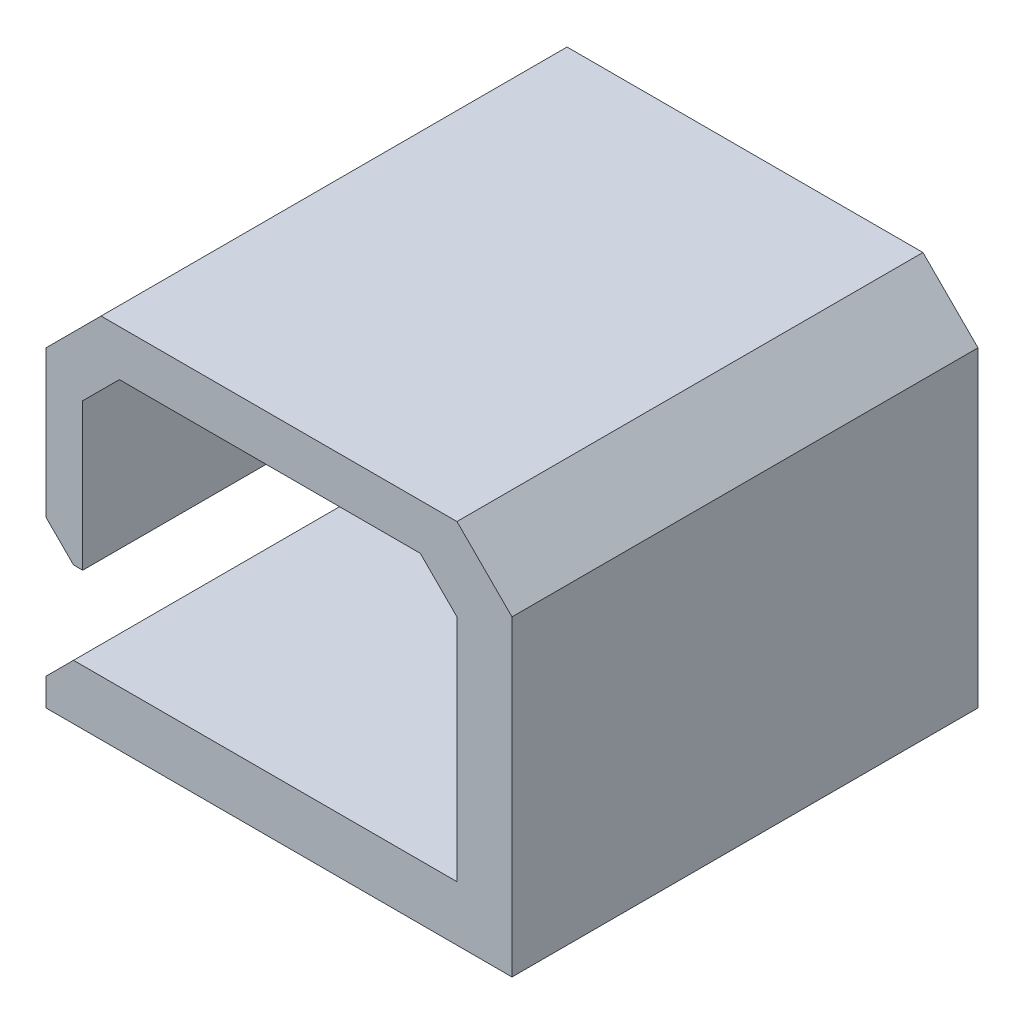
ISO-10303-21;
HEADER;
FILE_DESCRIPTION(('STEP AP214'),'2;1');
FILE_NAME('part.step','',(''),(''),'','','');
FILE_SCHEMA(('AUTOMOTIVE_DESIGN { 1 0 10303 214 1 1 1 1 }'));
ENDSEC;
DATA;
#1=APPLICATION_CONTEXT('core data for automotive mechanical design processes');
#2=APPLICATION_PROTOCOL_DEFINITION('international standard','automotive_design',2000,#1);
#3=PRODUCT_CONTEXT('',#1,'mechanical');
#4=PRODUCT('Part','Part','',(#3));
#5=PRODUCT_RELATED_PRODUCT_CATEGORY('part','',(#4));
#6=PRODUCT_DEFINITION_FORMATION('','',#4);
#7=PRODUCT_DEFINITION_CONTEXT('part definition',#1,'design');
#8=PRODUCT_DEFINITION('design','',#6,#7);
#9=PRODUCT_DEFINITION_SHAPE('','',#8);
#10=(LENGTH_UNIT() NAMED_UNIT(*) SI_UNIT(.MILLI.,.METRE.));
#11=(NAMED_UNIT(*) PLANE_ANGLE_UNIT() SI_UNIT($,.RADIAN.));
#12=(NAMED_UNIT(*) SI_UNIT($,.STERADIAN.) SOLID_ANGLE_UNIT());
#13=UNCERTAINTY_MEASURE_WITH_UNIT(LENGTH_MEASURE(1.E-05),#10,'distance_accuracy_value','');
#14=(GEOMETRIC_REPRESENTATION_CONTEXT(3) GLOBAL_UNCERTAINTY_ASSIGNED_CONTEXT((#13)) GLOBAL_UNIT_ASSIGNED_CONTEXT((#10,
#11,#12)) REPRESENTATION_CONTEXT('',''));
#15=CARTESIAN_POINT('',(0.,0.,0.));
#16=DIRECTION('',(0.,0.,1.));
#17=DIRECTION('',(1.,0.,0.));
#18=AXIS2_PLACEMENT_3D('',#15,#16,#17);
#19=CARTESIAN_POINT('',(-12.7,17.5,12.7));
#20=DIRECTION('',(0.,1.,0.));
#21=DIRECTION('',(0.,0.,1.));
#22=AXIS2_PLACEMENT_3D('',#19,#20,#21);
#23=PLANE('',#22);
#24=DIRECTION('',(1.,0.,0.));
#25=VECTOR('',#24,1.);
#26=CARTESIAN_POINT('',(-12.7,17.5,-12.7));
#27=LINE('',#26,#25);
#28=CARTESIAN_POINT('',(-8.7,17.5,-12.7));
#29=VERTEX_POINT('',#28);
#30=CARTESIAN_POINT('',(7.69999999999999,17.5,-12.7));
#31=VERTEX_POINT('',#30);
#32=EDGE_CURVE('E183',#29,#31,#27,.T.);
#33=ORIENTED_EDGE('',*,*,#32,.T.);
#34=DIRECTION('',(0.,0.,1.));
#35=VECTOR('',#34,1.);
#36=CARTESIAN_POINT('',(7.69999999999999,17.5,12.7));
#37=LINE('',#36,#35);
#38=CARTESIAN_POINT('',(7.69999999999999,17.5,12.7));
#39=VERTEX_POINT('',#38);
#40=EDGE_CURVE('E252',#31,#39,#37,.T.);
#41=ORIENTED_EDGE('',*,*,#40,.T.);
#42=DIRECTION('',(1.,0.,0.));
#43=VECTOR('',#42,1.);
#44=CARTESIAN_POINT('',(-12.7,17.5,12.7));
#45=LINE('',#44,#43);
#46=CARTESIAN_POINT('',(-8.7,17.5,12.7));
#47=VERTEX_POINT('',#46);
#48=EDGE_CURVE('E180',#47,#39,#45,.T.);
#49=ORIENTED_EDGE('',*,*,#48,.F.);
#50=DIRECTION('',(0.,0.,-1.));
#51=VECTOR('',#50,1.);
#52=CARTESIAN_POINT('',(-8.7,17.5,-12.7));
#53=LINE('',#52,#51);
#54=EDGE_CURVE('E250',#47,#29,#53,.T.);
#55=ORIENTED_EDGE('',*,*,#54,.T.);
#56=EDGE_LOOP('',(#33,#41,#49,#55));
#57=FACE_BOUND('',#56,.T.);
#58=ADVANCED_FACE('F33',(#57),#23,.F.);
#59=CARTESIAN_POINT('',(9.7,20.,-12.7));
#60=DIRECTION('',(1.,0.,0.));
#61=DIRECTION('',(0.,0.,-1.));
#62=AXIS2_PLACEMENT_3D('',#59,#60,#61);
#63=PLANE('',#62);
#64=DIRECTION('',(0.,-1.,0.));
#65=VECTOR('',#64,1.);
#66=CARTESIAN_POINT('',(9.70000000000001,20.,12.7));
#67=LINE('',#66,#65);
#68=CARTESIAN_POINT('',(9.70000000000001,15.5,12.7));
#69=VERTEX_POINT('',#68);
#70=CARTESIAN_POINT('',(9.70000000000001,3.,12.7));
#71=VERTEX_POINT('',#70);
#72=EDGE_CURVE('E193',#69,#71,#67,.T.);
#73=ORIENTED_EDGE('',*,*,#72,.F.);
#74=DIRECTION('',(0.,0.,-1.));
#75=VECTOR('',#74,1.);
#76=CARTESIAN_POINT('',(9.7,15.5,-12.7));
#77=LINE('',#76,#75);
#78=CARTESIAN_POINT('',(9.7,15.5,-12.7));
#79=VERTEX_POINT('',#78);
#80=EDGE_CURVE('E255',#69,#79,#77,.T.);
#81=ORIENTED_EDGE('',*,*,#80,.T.);
#82=DIRECTION('',(0.,-1.,0.));
#83=VECTOR('',#82,1.);
#84=CARTESIAN_POINT('',(9.7,20.,-12.7));
#85=LINE('',#84,#83);
#86=CARTESIAN_POINT('',(9.70000000000001,3.,-12.7));
#87=VERTEX_POINT('',#86);
#88=EDGE_CURVE('E198',#79,#87,#85,.T.);
#89=ORIENTED_EDGE('',*,*,#88,.T.);
#90=DIRECTION('',(0.,0.,1.));
#91=VECTOR('',#90,1.);
#92=CARTESIAN_POINT('',(9.7,3.,-12.7));
#93=LINE('',#92,#91);
#94=EDGE_CURVE('E186',#87,#71,#93,.T.);
#95=ORIENTED_EDGE('',*,*,#94,.T.);
#96=EDGE_LOOP('',(#73,#81,#89,#95));
#97=FACE_BOUND('',#96,.T.);
#98=ADVANCED_FACE('F280',(#97),#63,.F.);
#99=CARTESIAN_POINT('',(0.,3.,0.));
#100=DIRECTION('',(0.,-1.,0.));
#101=DIRECTION('',(0.,0.,-1.));
#102=AXIS2_PLACEMENT_3D('',#99,#100,#101);
#103=PLANE('',#102);
#104=DIRECTION('',(-1.,0.,0.));
#105=VECTOR('',#104,1.);
#106=CARTESIAN_POINT('',(-12.7,3.,-12.7));
#107=LINE('',#106,#105);
#108=CARTESIAN_POINT('',(-11.2,3.,-12.7));
#109=VERTEX_POINT('',#108);
#110=EDGE_CURVE('E201',#87,#109,#107,.T.);
#111=ORIENTED_EDGE('',*,*,#110,.T.);
#112=DIRECTION('',(0.,0.,1.));
#113=VECTOR('',#112,1.);
#114=CARTESIAN_POINT('',(-11.2,3.,0.));
#115=LINE('',#114,#113);
#116=CARTESIAN_POINT('',(-11.2,3.,12.7));
#117=VERTEX_POINT('',#116);
#118=EDGE_CURVE('E266',#109,#117,#115,.T.);
#119=ORIENTED_EDGE('',*,*,#118,.T.);
#120=DIRECTION('',(1.,0.,0.));
#121=VECTOR('',#120,1.);
#122=CARTESIAN_POINT('',(-12.7,3.,12.7));
#123=LINE('',#122,#121);
#124=EDGE_CURVE('E204',#117,#71,#123,.T.);
#125=ORIENTED_EDGE('',*,*,#124,.T.);
#126=ORIENTED_EDGE('',*,*,#94,.F.);
#127=EDGE_LOOP('',(#111,#119,#125,#126));
#128=FACE_BOUND('',#127,.T.);
#129=ADVANCED_FACE('F271',(#128),#103,.F.);
#130=CARTESIAN_POINT('',(12.7,3.,12.7));
#131=DIRECTION('',(-1.,0.,0.));
#132=DIRECTION('',(0.,0.,1.));
#133=AXIS2_PLACEMENT_3D('',#130,#131,#132);
#134=PLANE('',#133);
#135=DIRECTION('',(0.,-1.,0.));
#136=VECTOR('',#135,1.);
#137=CARTESIAN_POINT('',(12.7,3.,-12.7));
#138=LINE('',#137,#136);
#139=CARTESIAN_POINT('',(12.7,17.,-12.7));
#140=VERTEX_POINT('',#139);
#141=CARTESIAN_POINT('',(12.7,0.,-12.7));
#142=VERTEX_POINT('',#141);
#143=EDGE_CURVE('E223',#140,#142,#138,.T.);
#144=ORIENTED_EDGE('',*,*,#143,.F.);
#145=DIRECTION('',(0.,0.,1.));
#146=VECTOR('',#145,1.);
#147=CARTESIAN_POINT('',(12.7,17.,12.7));
#148=LINE('',#147,#146);
#149=CARTESIAN_POINT('',(12.7,17.,12.7));
#150=VERTEX_POINT('',#149);
#151=EDGE_CURVE('E241',#140,#150,#148,.T.);
#152=ORIENTED_EDGE('',*,*,#151,.T.);
#153=DIRECTION('',(0.,-1.,0.));
#154=VECTOR('',#153,1.);
#155=CARTESIAN_POINT('',(12.7,3.,12.7));
#156=LINE('',#155,#154);
#157=CARTESIAN_POINT('',(12.7,0.,12.7));
#158=VERTEX_POINT('',#157);
#159=EDGE_CURVE('E207',#150,#158,#156,.T.);
#160=ORIENTED_EDGE('',*,*,#159,.T.);
#161=DIRECTION('',(0.,0.,-1.));
#162=VECTOR('',#161,1.);
#163=CARTESIAN_POINT('',(12.7,0.,12.7));
#164=LINE('',#163,#162);
#165=EDGE_CURVE('E200',#158,#142,#164,.T.);
#166=ORIENTED_EDGE('',*,*,#165,.T.);
#167=EDGE_LOOP('',(#144,#152,#160,#166));
#168=FACE_BOUND('',#167,.T.);
#169=ADVANCED_FACE('F308',(#168),#134,.F.);
#170=CARTESIAN_POINT('',(-12.7,3.,-12.7));
#171=DIRECTION('',(0.,0.,1.));
#172=DIRECTION('',(1.,0.,0.));
#173=AXIS2_PLACEMENT_3D('',#170,#171,#172);
#174=PLANE('',#173);
#175=DIRECTION('',(0.,-1.,0.));
#176=VECTOR('',#175,1.);
#177=CARTESIAN_POINT('',(-12.7,3.,-12.7));
#178=LINE('',#177,#176);
#179=CARTESIAN_POINT('',(-12.7,1.50000000000001,-12.7));
#180=VERTEX_POINT('',#179);
#181=CARTESIAN_POINT('',(-12.7,0.,-12.7));
#182=VERTEX_POINT('',#181);
#183=EDGE_CURVE('E221',#180,#182,#178,.T.);
#184=ORIENTED_EDGE('',*,*,#183,.F.);
#185=DIRECTION('',(-0.707106781186547,-0.707106781186548,0.));
#186=VECTOR('',#185,1.);
#187=CARTESIAN_POINT('',(-11.2,3.,-12.7));
#188=LINE('',#187,#186);
#189=EDGE_CURVE('E11',#180,#109,#188,.F.);
#190=ORIENTED_EDGE('',*,*,#189,.T.);
#191=ORIENTED_EDGE('',*,*,#110,.F.);
#192=ORIENTED_EDGE('',*,*,#88,.F.);
#193=DIRECTION('',(0.707106781186552,-0.707106781186544,0.));
#194=VECTOR('',#193,1.);
#195=CARTESIAN_POINT('',(4.74999999999988,20.4500000000001,-12.7));
#196=LINE('',#195,#194);
#197=EDGE_CURVE('E261',#79,#31,#196,.F.);
#198=ORIENTED_EDGE('',*,*,#197,.T.);
#199=ORIENTED_EDGE('',*,*,#32,.F.);
#200=DIRECTION('',(0.707106781186544,0.707106781186551,0.));
#201=VECTOR('',#200,1.);
#202=CARTESIAN_POINT('',(-17.95,8.24999999999992,-12.7));
#203=LINE('',#202,#201);
#204=CARTESIAN_POINT('',(-10.7,15.5,-12.7));
#205=VERTEX_POINT('',#204);
#206=EDGE_CURVE('E161',#29,#205,#203,.F.);
#207=ORIENTED_EDGE('',*,*,#206,.T.);
#208=DIRECTION('',(0.,1.,0.));
#209=VECTOR('',#208,1.);
#210=CARTESIAN_POINT('',(-10.7,7.5,-12.7));
#211=LINE('',#210,#209);
#212=CARTESIAN_POINT('',(-10.7,7.5,-12.7));
#213=VERTEX_POINT('',#212);
#214=EDGE_CURVE('E157',#213,#205,#211,.T.);
#215=ORIENTED_EDGE('',*,*,#214,.F.);
#216=DIRECTION('',(1.,0.,0.));
#217=VECTOR('',#216,1.);
#218=CARTESIAN_POINT('',(-12.7,7.5,-12.7));
#219=LINE('',#218,#217);
#220=CARTESIAN_POINT('',(-11.2,7.5,-12.7));
#221=VERTEX_POINT('',#220);
#222=EDGE_CURVE('E144',#221,#213,#219,.T.);
#223=ORIENTED_EDGE('',*,*,#222,.F.);
#224=DIRECTION('',(-0.707106781186546,0.707106781186549,0.));
#225=VECTOR('',#224,1.);
#226=CARTESIAN_POINT('',(-11.2,7.5,-12.7));
#227=LINE('',#226,#225);
#228=CARTESIAN_POINT('',(-12.7,9.00000000000001,-12.7));
#229=VERTEX_POINT('',#228);
#230=EDGE_CURVE('E226',#221,#229,#227,.T.);
#231=ORIENTED_EDGE('',*,*,#230,.T.);
#232=DIRECTION('',(0.,-1.,0.));
#233=VECTOR('',#232,1.);
#234=CARTESIAN_POINT('',(-12.7,20.,-12.7));
#235=LINE('',#234,#233);
#236=CARTESIAN_POINT('',(-12.7,17.,-12.7));
#237=VERTEX_POINT('',#236);
#238=EDGE_CURVE('E178',#237,#229,#235,.T.);
#239=ORIENTED_EDGE('',*,*,#238,.F.);
#240=DIRECTION('',(-0.707106781186549,-0.707106781186546,0.));
#241=VECTOR('',#240,1.);
#242=CARTESIAN_POINT('',(-12.7,17.,-12.7));
#243=LINE('',#242,#241);
#244=CARTESIAN_POINT('',(-9.69999999999998,20.,-12.7));
#245=VERTEX_POINT('',#244);
#246=EDGE_CURVE('E237',#237,#245,#243,.F.);
#247=ORIENTED_EDGE('',*,*,#246,.T.);
#248=DIRECTION('',(-1.,0.,0.));
#249=VECTOR('',#248,1.);
#250=CARTESIAN_POINT('',(12.7,20.,-12.7));
#251=LINE('',#250,#249);
#252=CARTESIAN_POINT('',(9.70000000000001,20.,-12.7));
#253=VERTEX_POINT('',#252);
#254=EDGE_CURVE('E187',#253,#245,#251,.T.);
#255=ORIENTED_EDGE('',*,*,#254,.F.);
#256=DIRECTION('',(-0.707106781186546,0.707106781186549,0.));
#257=VECTOR('',#256,1.);
#258=CARTESIAN_POINT('',(9.70000000000001,20.,-12.7));
#259=LINE('',#258,#257);
#260=EDGE_CURVE('E239',#253,#140,#259,.F.);
#261=ORIENTED_EDGE('',*,*,#260,.T.);
#262=ORIENTED_EDGE('',*,*,#143,.T.);
#263=DIRECTION('',(-1.,0.,0.));
#264=VECTOR('',#263,1.);
#265=CARTESIAN_POINT('',(-12.7,0.,-12.7));
#266=LINE('',#265,#264);
#267=EDGE_CURVE('E210',#142,#182,#266,.T.);
#268=ORIENTED_EDGE('',*,*,#267,.T.);
#269=EDGE_LOOP('',(#184,#190,#191,#192,#198,#199,#207,#215,#223,#231,#239,#247,#255,#261,#262,#268));
#270=FACE_BOUND('',#269,.T.);
#271=ADVANCED_FACE('F158',(#270),#174,.F.);
#272=CARTESIAN_POINT('',(-12.7,3.,12.7));
#273=DIRECTION('',(1.,0.,0.));
#274=DIRECTION('',(0.,0.,-1.));
#275=AXIS2_PLACEMENT_3D('',#272,#273,#274);
#276=PLANE('',#275);
#277=DIRECTION('',(0.,-1.,0.));
#278=VECTOR('',#277,1.);
#279=CARTESIAN_POINT('',(-12.7,3.,12.7));
#280=LINE('',#279,#278);
#281=CARTESIAN_POINT('',(-12.7,1.50000000000001,12.7));
#282=VERTEX_POINT('',#281);
#283=CARTESIAN_POINT('',(-12.7,0.,12.7));
#284=VERTEX_POINT('',#283);
#285=EDGE_CURVE('E219',#282,#284,#280,.T.);
#286=ORIENTED_EDGE('',*,*,#285,.F.);
#287=DIRECTION('',(0.,0.,-1.));
#288=VECTOR('',#287,1.);
#289=CARTESIAN_POINT('',(-12.7,1.50000000000001,12.7));
#290=LINE('',#289,#288);
#291=EDGE_CURVE('E41',#282,#180,#290,.T.);
#292=ORIENTED_EDGE('',*,*,#291,.T.);
#293=ORIENTED_EDGE('',*,*,#183,.T.);
#294=DIRECTION('',(0.,0.,1.));
#295=VECTOR('',#294,1.);
#296=CARTESIAN_POINT('',(-12.7,0.,12.7));
#297=LINE('',#296,#295);
#298=EDGE_CURVE('E213',#182,#284,#297,.T.);
#299=ORIENTED_EDGE('',*,*,#298,.T.);
#300=EDGE_LOOP('',(#286,#292,#293,#299));
#301=FACE_BOUND('',#300,.T.);
#302=ADVANCED_FACE('F314',(#301),#276,.F.);
#303=CARTESIAN_POINT('',(-12.7,3.,12.7));
#304=DIRECTION('',(0.,0.,-1.));
#305=DIRECTION('',(-1.,0.,0.));
#306=AXIS2_PLACEMENT_3D('',#303,#304,#305);
#307=PLANE('',#306);
#308=ORIENTED_EDGE('',*,*,#124,.F.);
#309=DIRECTION('',(0.707106781186547,0.707106781186548,0.));
#310=VECTOR('',#309,1.);
#311=CARTESIAN_POINT('',(-11.2,3.,12.7));
#312=LINE('',#311,#310);
#313=EDGE_CURVE('E55',#117,#282,#312,.F.);
#314=ORIENTED_EDGE('',*,*,#313,.T.);
#315=ORIENTED_EDGE('',*,*,#285,.T.);
#316=DIRECTION('',(1.,0.,0.));
#317=VECTOR('',#316,1.);
#318=CARTESIAN_POINT('',(-12.7,0.,12.7));
#319=LINE('',#318,#317);
#320=EDGE_CURVE('E205',#284,#158,#319,.T.);
#321=ORIENTED_EDGE('',*,*,#320,.T.);
#322=ORIENTED_EDGE('',*,*,#159,.F.);
#323=DIRECTION('',(0.707106781186546,-0.707106781186549,0.));
#324=VECTOR('',#323,1.);
#325=CARTESIAN_POINT('',(9.70000000000001,20.,12.7));
#326=LINE('',#325,#324);
#327=CARTESIAN_POINT('',(9.70000000000001,20.,12.7));
#328=VERTEX_POINT('',#327);
#329=EDGE_CURVE('E245',#150,#328,#326,.F.);
#330=ORIENTED_EDGE('',*,*,#329,.T.);
#331=DIRECTION('',(1.,0.,0.));
#332=VECTOR('',#331,1.);
#333=CARTESIAN_POINT('',(12.7,20.,12.7));
#334=LINE('',#333,#332);
#335=CARTESIAN_POINT('',(-9.69999999999997,20.,12.7));
#336=VERTEX_POINT('',#335);
#337=EDGE_CURVE('E190',#336,#328,#334,.T.);
#338=ORIENTED_EDGE('',*,*,#337,.F.);
#339=DIRECTION('',(0.707106781186549,0.707106781186546,0.));
#340=VECTOR('',#339,1.);
#341=CARTESIAN_POINT('',(-12.7,17.,12.7));
#342=LINE('',#341,#340);
#343=CARTESIAN_POINT('',(-12.7,17.,12.7));
#344=VERTEX_POINT('',#343);
#345=EDGE_CURVE('E243',#336,#344,#342,.F.);
#346=ORIENTED_EDGE('',*,*,#345,.T.);
#347=DIRECTION('',(0.,1.,0.));
#348=VECTOR('',#347,1.);
#349=CARTESIAN_POINT('',(-12.7,20.,12.7));
#350=LINE('',#349,#348);
#351=CARTESIAN_POINT('',(-12.7,9.00000000000001,12.7));
#352=VERTEX_POINT('',#351);
#353=EDGE_CURVE('E165',#352,#344,#350,.T.);
#354=ORIENTED_EDGE('',*,*,#353,.F.);
#355=DIRECTION('',(0.707106781186546,-0.707106781186549,0.));
#356=VECTOR('',#355,1.);
#357=CARTESIAN_POINT('',(-11.2,7.5,12.7));
#358=LINE('',#357,#356);
#359=CARTESIAN_POINT('',(-11.2,7.5,12.7));
#360=VERTEX_POINT('',#359);
#361=EDGE_CURVE('E230',#352,#360,#358,.T.);
#362=ORIENTED_EDGE('',*,*,#361,.T.);
#363=DIRECTION('',(-1.,0.,0.));
#364=VECTOR('',#363,1.);
#365=CARTESIAN_POINT('',(-12.7,7.5,12.7));
#366=LINE('',#365,#364);
#367=CARTESIAN_POINT('',(-10.7,7.5,12.7));
#368=VERTEX_POINT('',#367);
#369=EDGE_CURVE('E171',#368,#360,#366,.T.);
#370=ORIENTED_EDGE('',*,*,#369,.F.);
#371=DIRECTION('',(0.,1.,0.));
#372=VECTOR('',#371,1.);
#373=CARTESIAN_POINT('',(-10.7,7.5,12.7));
#374=LINE('',#373,#372);
#375=CARTESIAN_POINT('',(-10.7,15.5,12.7));
#376=VERTEX_POINT('',#375);
#377=EDGE_CURVE('E166',#368,#376,#374,.T.);
#378=ORIENTED_EDGE('',*,*,#377,.T.);
#379=DIRECTION('',(-0.707106781186544,-0.707106781186551,0.));
#380=VECTOR('',#379,1.);
#381=CARTESIAN_POINT('',(-17.95,8.24999999999993,12.7));
#382=LINE('',#381,#380);
#383=EDGE_CURVE('E263',#376,#47,#382,.F.);
#384=ORIENTED_EDGE('',*,*,#383,.T.);
#385=ORIENTED_EDGE('',*,*,#48,.T.);
#386=DIRECTION('',(-0.707106781186552,0.707106781186544,0.));
#387=VECTOR('',#386,1.);
#388=CARTESIAN_POINT('',(4.74999999999989,20.4500000000001,12.7));
#389=LINE('',#388,#387);
#390=EDGE_CURVE('E259',#39,#69,#389,.F.);
#391=ORIENTED_EDGE('',*,*,#390,.T.);
#392=ORIENTED_EDGE('',*,*,#72,.T.);
#393=EDGE_LOOP('',(#308,#314,#315,#321,#322,#330,#338,#346,#354,#362,#370,#378,#384,#385,#391,#392));
#394=FACE_BOUND('',#393,.T.);
#395=ADVANCED_FACE('F276',(#394),#307,.F.);
#396=CARTESIAN_POINT('',(0.,0.,0.));
#397=DIRECTION('',(0.,-1.,0.));
#398=DIRECTION('',(0.,0.,-1.));
#399=AXIS2_PLACEMENT_3D('',#396,#397,#398);
#400=PLANE('',#399);
#401=ORIENTED_EDGE('',*,*,#165,.F.);
#402=ORIENTED_EDGE('',*,*,#320,.F.);
#403=ORIENTED_EDGE('',*,*,#298,.F.);
#404=ORIENTED_EDGE('',*,*,#267,.F.);
#405=EDGE_LOOP('',(#401,#402,#403,#404));
#406=FACE_BOUND('',#405,.T.);
#407=ADVANCED_FACE('F303',(#406),#400,.T.);
#408=CARTESIAN_POINT('',(0.,20.,0.));
#409=DIRECTION('',(0.,-1.,0.));
#410=DIRECTION('',(0.,0.,-1.));
#411=AXIS2_PLACEMENT_3D('',#408,#409,#410);
#412=PLANE('',#411);
#413=ORIENTED_EDGE('',*,*,#337,.T.);
#414=DIRECTION('',(0.,0.,-1.));
#415=VECTOR('',#414,1.);
#416=CARTESIAN_POINT('',(9.70000000000001,20.,0.));
#417=LINE('',#416,#415);
#418=EDGE_CURVE('E234',#328,#253,#417,.T.);
#419=ORIENTED_EDGE('',*,*,#418,.T.);
#420=ORIENTED_EDGE('',*,*,#254,.T.);
#421=DIRECTION('',(0.,0.,1.));
#422=VECTOR('',#421,1.);
#423=CARTESIAN_POINT('',(-9.69999999999997,20.,0.));
#424=LINE('',#423,#422);
#425=EDGE_CURVE('E232',#245,#336,#424,.T.);
#426=ORIENTED_EDGE('',*,*,#425,.T.);
#427=EDGE_LOOP('',(#413,#419,#420,#426));
#428=FACE_BOUND('',#427,.T.);
#429=ADVANCED_FACE('F301',(#428),#412,.F.);
#430=CARTESIAN_POINT('',(-12.7,0.,0.));
#431=DIRECTION('',(1.,0.,0.));
#432=DIRECTION('',(0.,0.,-1.));
#433=AXIS2_PLACEMENT_3D('',#430,#431,#432);
#434=PLANE('',#433);
#435=ORIENTED_EDGE('',*,*,#353,.T.);
#436=DIRECTION('',(0.,0.,-1.));
#437=VECTOR('',#436,1.);
#438=CARTESIAN_POINT('',(-12.7,17.,0.));
#439=LINE('',#438,#437);
#440=EDGE_CURVE('E247',#344,#237,#439,.T.);
#441=ORIENTED_EDGE('',*,*,#440,.T.);
#442=ORIENTED_EDGE('',*,*,#238,.T.);
#443=DIRECTION('',(0.,0.,1.));
#444=VECTOR('',#443,1.);
#445=CARTESIAN_POINT('',(-12.7,9.00000000000001,12.7));
#446=LINE('',#445,#444);
#447=EDGE_CURVE('E228',#229,#352,#446,.T.);
#448=ORIENTED_EDGE('',*,*,#447,.T.);
#449=EDGE_LOOP('',(#435,#441,#442,#448));
#450=FACE_BOUND('',#449,.T.);
#451=ADVANCED_FACE('F299',(#450),#434,.F.);
#452=CARTESIAN_POINT('',(-10.7,7.5,12.7));
#453=DIRECTION('',(-1.,0.,0.));
#454=DIRECTION('',(0.,0.,1.));
#455=AXIS2_PLACEMENT_3D('',#452,#453,#454);
#456=PLANE('',#455);
#457=ORIENTED_EDGE('',*,*,#214,.T.);
#458=DIRECTION('',(0.,0.,1.));
#459=VECTOR('',#458,1.);
#460=CARTESIAN_POINT('',(-10.7,15.5,12.7));
#461=LINE('',#460,#459);
#462=EDGE_CURVE('E257',#205,#376,#461,.T.);
#463=ORIENTED_EDGE('',*,*,#462,.T.);
#464=ORIENTED_EDGE('',*,*,#377,.F.);
#465=DIRECTION('',(0.,0.,1.));
#466=VECTOR('',#465,1.);
#467=CARTESIAN_POINT('',(-10.7,7.5,12.7));
#468=LINE('',#467,#466);
#469=EDGE_CURVE('E149',#213,#368,#468,.T.);
#470=ORIENTED_EDGE('',*,*,#469,.F.);
#471=EDGE_LOOP('',(#457,#463,#464,#470));
#472=FACE_BOUND('',#471,.T.);
#473=ADVANCED_FACE('F168',(#472),#456,.F.);
#474=CARTESIAN_POINT('',(0.,7.5,0.));
#475=DIRECTION('',(0.,-1.,0.));
#476=DIRECTION('',(0.,0.,-1.));
#477=AXIS2_PLACEMENT_3D('',#474,#475,#476);
#478=PLANE('',#477);
#479=ORIENTED_EDGE('',*,*,#369,.T.);
#480=DIRECTION('',(0.,0.,-1.));
#481=VECTOR('',#480,1.);
#482=CARTESIAN_POINT('',(-11.2,7.5,-12.7));
#483=LINE('',#482,#481);
#484=EDGE_CURVE('E152',#360,#221,#483,.T.);
#485=ORIENTED_EDGE('',*,*,#484,.T.);
#486=ORIENTED_EDGE('',*,*,#222,.T.);
#487=ORIENTED_EDGE('',*,*,#469,.T.);
#488=EDGE_LOOP('',(#479,#485,#486,#487));
#489=FACE_BOUND('',#488,.T.);
#490=ADVANCED_FACE('F147',(#489),#478,.T.);
#491=CARTESIAN_POINT('',(-11.2,7.5,0.));
#492=DIRECTION('',(-0.707106781186549,-0.707106781186546,0.));
#493=DIRECTION('',(0.,0.,1.));
#494=AXIS2_PLACEMENT_3D('',#491,#492,#493);
#495=PLANE('',#494);
#496=ORIENTED_EDGE('',*,*,#361,.F.);
#497=ORIENTED_EDGE('',*,*,#447,.F.);
#498=ORIENTED_EDGE('',*,*,#230,.F.);
#499=ORIENTED_EDGE('',*,*,#484,.F.);
#500=EDGE_LOOP('',(#496,#497,#498,#499));
#501=FACE_BOUND('',#500,.T.);
#502=ADVANCED_FACE('F322',(#501),#495,.T.);
#503=CARTESIAN_POINT('',(9.70000000000001,20.,0.));
#504=DIRECTION('',(-0.707106781186549,-0.707106781186546,0.));
#505=DIRECTION('',(0.,0.,-1.));
#506=AXIS2_PLACEMENT_3D('',#503,#504,#505);
#507=PLANE('',#506);
#508=ORIENTED_EDGE('',*,*,#329,.F.);
#509=ORIENTED_EDGE('',*,*,#151,.F.);
#510=ORIENTED_EDGE('',*,*,#260,.F.);
#511=ORIENTED_EDGE('',*,*,#418,.F.);
#512=EDGE_LOOP('',(#508,#509,#510,#511));
#513=FACE_BOUND('',#512,.T.);
#514=ADVANCED_FACE('F325',(#513),#507,.F.);
#515=CARTESIAN_POINT('',(-12.7,17.,0.));
#516=DIRECTION('',(0.707106781186546,-0.707106781186549,0.));
#517=DIRECTION('',(0.,0.,-1.));
#518=AXIS2_PLACEMENT_3D('',#515,#516,#517);
#519=PLANE('',#518);
#520=ORIENTED_EDGE('',*,*,#345,.F.);
#521=ORIENTED_EDGE('',*,*,#425,.F.);
#522=ORIENTED_EDGE('',*,*,#246,.F.);
#523=ORIENTED_EDGE('',*,*,#440,.F.);
#524=EDGE_LOOP('',(#520,#521,#522,#523));
#525=FACE_BOUND('',#524,.T.);
#526=ADVANCED_FACE('F329',(#525),#519,.F.);
#527=CARTESIAN_POINT('',(7.69999999999999,17.5,12.7));
#528=DIRECTION('',(-0.707106781186544,-0.707106781186552,0.));
#529=DIRECTION('',(0.,0.,-1.));
#530=AXIS2_PLACEMENT_3D('',#527,#528,#529);
#531=PLANE('',#530);
#532=ORIENTED_EDGE('',*,*,#197,.F.);
#533=ORIENTED_EDGE('',*,*,#80,.F.);
#534=ORIENTED_EDGE('',*,*,#390,.F.);
#535=ORIENTED_EDGE('',*,*,#40,.F.);
#536=EDGE_LOOP('',(#532,#533,#534,#535));
#537=FACE_BOUND('',#536,.T.);
#538=ADVANCED_FACE('F288',(#537),#531,.T.);
#539=CARTESIAN_POINT('',(-10.7,15.5,12.7));
#540=DIRECTION('',(0.707106781186551,-0.707106781186544,0.));
#541=DIRECTION('',(0.,0.,-1.));
#542=AXIS2_PLACEMENT_3D('',#539,#540,#541);
#543=PLANE('',#542);
#544=ORIENTED_EDGE('',*,*,#206,.F.);
#545=ORIENTED_EDGE('',*,*,#54,.F.);
#546=ORIENTED_EDGE('',*,*,#383,.F.);
#547=ORIENTED_EDGE('',*,*,#462,.F.);
#548=EDGE_LOOP('',(#544,#545,#546,#547));
#549=FACE_BOUND('',#548,.T.);
#550=ADVANCED_FACE('F284',(#549),#543,.T.);
#551=CARTESIAN_POINT('',(-11.2,3.,0.));
#552=DIRECTION('',(0.707106781186548,-0.707106781186547,0.));
#553=DIRECTION('',(0.,0.,1.));
#554=AXIS2_PLACEMENT_3D('',#551,#552,#553);
#555=PLANE('',#554);
#556=ORIENTED_EDGE('',*,*,#189,.F.);
#557=ORIENTED_EDGE('',*,*,#291,.F.);
#558=ORIENTED_EDGE('',*,*,#313,.F.);
#559=ORIENTED_EDGE('',*,*,#118,.F.);
#560=EDGE_LOOP('',(#556,#557,#558,#559));
#561=FACE_BOUND('',#560,.T.);
#562=ADVANCED_FACE('F35',(#561),#555,.F.);
#563=CLOSED_SHELL('',(#58,#98,#129,#169,#271,#302,#395,#407,#429,#451,#473,#490,#502,#514,#526,
#538,#550,#562));
#564=MANIFOLD_SOLID_BREP('B2',#563);
#565=ADVANCED_BREP_SHAPE_REPRESENTATION('',(#18,#564),#14);
#566=SHAPE_DEFINITION_REPRESENTATION(#9,#565);
ENDSEC;
END-ISO-10303-21;
